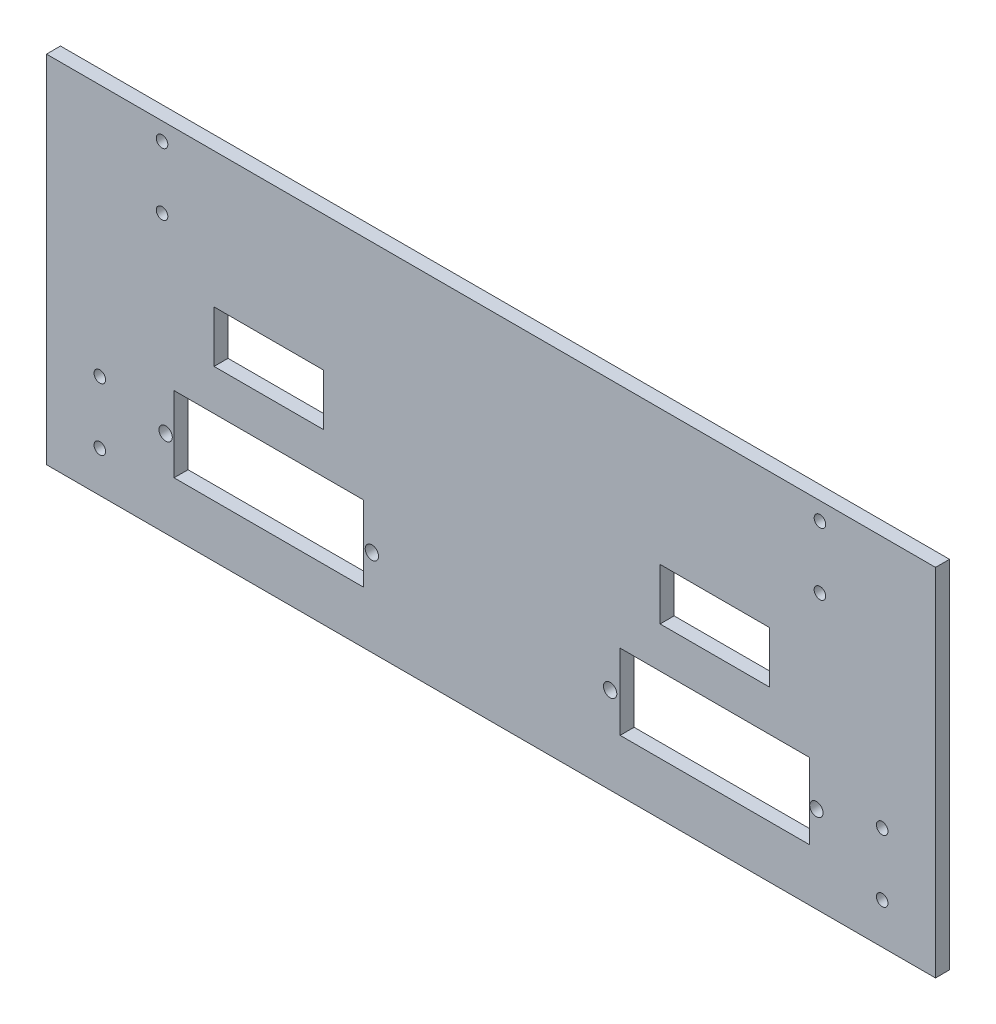
ISO-10303-21;
HEADER;
FILE_DESCRIPTION(('STEP AP214'),'2;1');
FILE_NAME('part.step','',(''),(''),'','','');
FILE_SCHEMA(('AUTOMOTIVE_DESIGN { 1 0 10303 214 1 1 1 1 }'));
ENDSEC;
DATA;
#1=APPLICATION_CONTEXT('core data for automotive mechanical design processes');
#2=APPLICATION_PROTOCOL_DEFINITION('international standard','automotive_design',2000,#1);
#3=PRODUCT_CONTEXT('',#1,'mechanical');
#4=PRODUCT('Part','Part','',(#3));
#5=PRODUCT_RELATED_PRODUCT_CATEGORY('part','',(#4));
#6=PRODUCT_DEFINITION_FORMATION('','',#4);
#7=PRODUCT_DEFINITION_CONTEXT('part definition',#1,'design');
#8=PRODUCT_DEFINITION('design','',#6,#7);
#9=PRODUCT_DEFINITION_SHAPE('','',#8);
#10=(LENGTH_UNIT() NAMED_UNIT(*) SI_UNIT(.MILLI.,.METRE.));
#11=(NAMED_UNIT(*) PLANE_ANGLE_UNIT() SI_UNIT($,.RADIAN.));
#12=(NAMED_UNIT(*) SI_UNIT($,.STERADIAN.) SOLID_ANGLE_UNIT());
#13=UNCERTAINTY_MEASURE_WITH_UNIT(LENGTH_MEASURE(1.E-05),#10,'distance_accuracy_value','');
#14=(GEOMETRIC_REPRESENTATION_CONTEXT(3) GLOBAL_UNCERTAINTY_ASSIGNED_CONTEXT((#13)) GLOBAL_UNIT_ASSIGNED_CONTEXT((#10,
#11,#12)) REPRESENTATION_CONTEXT('',''));
#15=CARTESIAN_POINT('',(0.,0.,0.));
#16=DIRECTION('',(0.,0.,1.));
#17=DIRECTION('',(1.,0.,0.));
#18=AXIS2_PLACEMENT_3D('',#15,#16,#17);
#19=CARTESIAN_POINT('',(0.,0.,4.));
#20=DIRECTION('',(0.,0.,-1.));
#21=DIRECTION('',(-1.,0.,0.));
#22=AXIS2_PLACEMENT_3D('',#19,#20,#21);
#23=PLANE('',#22);
#24=DIRECTION('',(0.,1.,0.));
#25=VECTOR('',#24,1.);
#26=CARTESIAN_POINT('',(79.121,62.992,4.));
#27=LINE('',#26,#25);
#28=CARTESIAN_POINT('',(79.121,48.26,4.));
#29=VERTEX_POINT('',#28);
#30=CARTESIAN_POINT('',(79.121,62.992,4.));
#31=VERTEX_POINT('',#30);
#32=EDGE_CURVE('E229',#29,#31,#27,.T.);
#33=ORIENTED_EDGE('',*,*,#32,.F.);
#34=DIRECTION('',(1.,0.,0.));
#35=VECTOR('',#34,1.);
#36=CARTESIAN_POINT('',(47.879,48.26,4.));
#37=LINE('',#36,#35);
#38=CARTESIAN_POINT('',(47.879,48.26,4.));
#39=VERTEX_POINT('',#38);
#40=EDGE_CURVE('E240',#39,#29,#37,.T.);
#41=ORIENTED_EDGE('',*,*,#40,.F.);
#42=DIRECTION('',(0.,-1.,0.));
#43=VECTOR('',#42,1.);
#44=CARTESIAN_POINT('',(47.879,62.992,4.));
#45=LINE('',#44,#43);
#46=CARTESIAN_POINT('',(47.879,62.992,4.));
#47=VERTEX_POINT('',#46);
#48=EDGE_CURVE('E236',#47,#39,#45,.T.);
#49=ORIENTED_EDGE('',*,*,#48,.F.);
#50=DIRECTION('',(-1.,0.,0.));
#51=VECTOR('',#50,1.);
#52=CARTESIAN_POINT('',(47.879,62.992,4.));
#53=LINE('',#52,#51);
#54=EDGE_CURVE('E232',#31,#47,#53,.T.);
#55=ORIENTED_EDGE('',*,*,#54,.F.);
#56=EDGE_LOOP('',(#33,#41,#49,#55));
#57=FACE_BOUND('',#56,.T.);
#58=CARTESIAN_POINT('',(15.24,29.464,4.));
#59=DIRECTION('',(0.,0.,1.));
#60=DIRECTION('',(1.,0.,0.));
#61=AXIS2_PLACEMENT_3D('',#58,#59,#60);
#62=CIRCLE('',#61,1.651);
#63=CARTESIAN_POINT('',(16.891,29.464,4.));
#64=VERTEX_POINT('',#63);
#65=EDGE_CURVE('E345',#64,#64,#62,.T.);
#66=ORIENTED_EDGE('',*,*,#65,.F.);
#67=EDGE_LOOP('',(#66));
#68=FACE_BOUND('',#67,.T.);
#69=CARTESIAN_POINT('',(15.24,11.684,4.));
#70=DIRECTION('',(0.,0.,1.));
#71=DIRECTION('',(1.,0.,0.));
#72=AXIS2_PLACEMENT_3D('',#69,#70,#71);
#73=CIRCLE('',#72,1.651);
#74=CARTESIAN_POINT('',(16.891,11.684,4.));
#75=VERTEX_POINT('',#74);
#76=EDGE_CURVE('E353',#75,#75,#73,.T.);
#77=ORIENTED_EDGE('',*,*,#76,.F.);
#78=EDGE_LOOP('',(#77));
#79=FACE_BOUND('',#78,.T.);
#80=CARTESIAN_POINT('',(220.98,96.52,4.));
#81=DIRECTION('',(0.,0.,1.));
#82=DIRECTION('',(1.,0.,0.));
#83=AXIS2_PLACEMENT_3D('',#80,#81,#82);
#84=CIRCLE('',#83,1.65099999999999);
#85=CARTESIAN_POINT('',(222.631,96.52,4.));
#86=VERTEX_POINT('',#85);
#87=EDGE_CURVE('E361',#86,#86,#84,.T.);
#88=ORIENTED_EDGE('',*,*,#87,.F.);
#89=EDGE_LOOP('',(#88));
#90=FACE_BOUND('',#89,.T.);
#91=CARTESIAN_POINT('',(220.98,78.74,4.));
#92=DIRECTION('',(0.,0.,1.));
#93=DIRECTION('',(1.,0.,0.));
#94=AXIS2_PLACEMENT_3D('',#91,#92,#93);
#95=CIRCLE('',#94,1.65099999999999);
#96=CARTESIAN_POINT('',(222.631,78.74,4.));
#97=VERTEX_POINT('',#96);
#98=EDGE_CURVE('E369',#97,#97,#95,.T.);
#99=ORIENTED_EDGE('',*,*,#98,.F.);
#100=EDGE_LOOP('',(#99));
#101=FACE_BOUND('',#100,.T.);
#102=CARTESIAN_POINT('',(33.02,96.52,4.));
#103=DIRECTION('',(0.,0.,1.));
#104=DIRECTION('',(1.,0.,0.));
#105=AXIS2_PLACEMENT_3D('',#102,#103,#104);
#106=CIRCLE('',#105,1.651);
#107=CARTESIAN_POINT('',(34.671,96.52,4.));
#108=VERTEX_POINT('',#107);
#109=EDGE_CURVE('E377',#108,#108,#106,.T.);
#110=ORIENTED_EDGE('',*,*,#109,.F.);
#111=EDGE_LOOP('',(#110));
#112=FACE_BOUND('',#111,.T.);
#113=CARTESIAN_POINT('',(33.02,78.74,4.));
#114=DIRECTION('',(0.,0.,1.));
#115=DIRECTION('',(1.,0.,0.));
#116=AXIS2_PLACEMENT_3D('',#113,#114,#115);
#117=CIRCLE('',#116,1.651);
#118=CARTESIAN_POINT('',(34.671,78.74,4.));
#119=VERTEX_POINT('',#118);
#120=EDGE_CURVE('E385',#119,#119,#117,.T.);
#121=ORIENTED_EDGE('',*,*,#120,.F.);
#122=EDGE_LOOP('',(#121));
#123=FACE_BOUND('',#122,.T.);
#124=CARTESIAN_POINT('',(92.964,24.765,4.));
#125=DIRECTION('',(0.,0.,1.));
#126=DIRECTION('',(1.,0.,0.));
#127=AXIS2_PLACEMENT_3D('',#124,#125,#126);
#128=CIRCLE('',#127,1.90500000000001);
#129=CARTESIAN_POINT('',(94.869,24.765,4.));
#130=VERTEX_POINT('',#129);
#131=EDGE_CURVE('E393',#130,#130,#128,.T.);
#132=ORIENTED_EDGE('',*,*,#131,.F.);
#133=EDGE_LOOP('',(#132));
#134=FACE_BOUND('',#133,.T.);
#135=CARTESIAN_POINT('',(34.036,24.765,4.));
#136=DIRECTION('',(0.,0.,1.));
#137=DIRECTION('',(1.,0.,0.));
#138=AXIS2_PLACEMENT_3D('',#135,#136,#137);
#139=CIRCLE('',#138,1.905);
#140=CARTESIAN_POINT('',(35.941,24.765,4.));
#141=VERTEX_POINT('',#140);
#142=EDGE_CURVE('E401',#141,#141,#139,.T.);
#143=ORIENTED_EDGE('',*,*,#142,.F.);
#144=EDGE_LOOP('',(#143));
#145=FACE_BOUND('',#144,.T.);
#146=DIRECTION('',(1.,0.,0.));
#147=VECTOR('',#146,1.);
#148=CARTESIAN_POINT('',(36.449,14.986,4.));
#149=LINE('',#148,#147);
#150=CARTESIAN_POINT('',(36.449,14.986,4.));
#151=VERTEX_POINT('',#150);
#152=CARTESIAN_POINT('',(90.551,14.986,4.));
#153=VERTEX_POINT('',#152);
#154=EDGE_CURVE('E409',#151,#153,#149,.T.);
#155=ORIENTED_EDGE('',*,*,#154,.F.);
#156=DIRECTION('',(0.,-1.,0.));
#157=VECTOR('',#156,1.);
#158=CARTESIAN_POINT('',(36.449,36.576,4.));
#159=LINE('',#158,#157);
#160=CARTESIAN_POINT('',(36.449,36.576,4.));
#161=VERTEX_POINT('',#160);
#162=EDGE_CURVE('E420',#161,#151,#159,.T.);
#163=ORIENTED_EDGE('',*,*,#162,.F.);
#164=DIRECTION('',(-1.,0.,0.));
#165=VECTOR('',#164,1.);
#166=CARTESIAN_POINT('',(90.551,36.576,4.));
#167=LINE('',#166,#165);
#168=CARTESIAN_POINT('',(90.551,36.576,4.));
#169=VERTEX_POINT('',#168);
#170=EDGE_CURVE('E416',#169,#161,#167,.T.);
#171=ORIENTED_EDGE('',*,*,#170,.F.);
#172=DIRECTION('',(0.,1.,0.));
#173=VECTOR('',#172,1.);
#174=CARTESIAN_POINT('',(90.551,14.986,4.));
#175=LINE('',#174,#173);
#176=EDGE_CURVE('E412',#153,#169,#175,.T.);
#177=ORIENTED_EDGE('',*,*,#176,.F.);
#178=EDGE_LOOP('',(#155,#163,#171,#177));
#179=FACE_BOUND('',#178,.T.);
#180=DIRECTION('',(1.,0.,0.));
#181=VECTOR('',#180,1.);
#182=CARTESIAN_POINT('',(0.,0.,4.));
#183=LINE('',#182,#181);
#184=CARTESIAN_POINT('',(0.,0.,4.));
#185=VERTEX_POINT('',#184);
#186=CARTESIAN_POINT('',(254.,0.,4.));
#187=VERTEX_POINT('',#186);
#188=EDGE_CURVE('E450',#185,#187,#183,.T.);
#189=ORIENTED_EDGE('',*,*,#188,.T.);
#190=DIRECTION('',(0.,1.,0.));
#191=VECTOR('',#190,1.);
#192=CARTESIAN_POINT('',(254.,101.6,4.));
#193=LINE('',#192,#191);
#194=CARTESIAN_POINT('',(254.,101.6,4.));
#195=VERTEX_POINT('',#194);
#196=EDGE_CURVE('E454',#187,#195,#193,.T.);
#197=ORIENTED_EDGE('',*,*,#196,.T.);
#198=DIRECTION('',(-1.,0.,0.));
#199=VECTOR('',#198,1.);
#200=CARTESIAN_POINT('',(0.,101.6,4.));
#201=LINE('',#200,#199);
#202=CARTESIAN_POINT('',(0.,101.6,4.));
#203=VERTEX_POINT('',#202);
#204=EDGE_CURVE('E458',#195,#203,#201,.T.);
#205=ORIENTED_EDGE('',*,*,#204,.T.);
#206=DIRECTION('',(0.,-1.,0.));
#207=VECTOR('',#206,1.);
#208=CARTESIAN_POINT('',(0.,0.,4.));
#209=LINE('',#208,#207);
#210=EDGE_CURVE('E461',#203,#185,#209,.T.);
#211=ORIENTED_EDGE('',*,*,#210,.T.);
#212=EDGE_LOOP('',(#189,#197,#205,#211));
#213=FACE_BOUND('',#212,.T.);
#214=DIRECTION('',(1.,0.,0.));
#215=VECTOR('',#214,1.);
#216=CARTESIAN_POINT('',(163.890331934584,14.9805038898976,4.));
#217=LINE('',#216,#215);
#218=CARTESIAN_POINT('',(163.890331934584,14.9805038898976,4.));
#219=VERTEX_POINT('',#218);
#220=CARTESIAN_POINT('',(217.992332171612,14.9805038898976,4.));
#221=VERTEX_POINT('',#220);
#222=EDGE_CURVE('E304',#219,#221,#217,.T.);
#223=ORIENTED_EDGE('',*,*,#222,.F.);
#224=DIRECTION('',(0.,-1.,0.));
#225=VECTOR('',#224,1.);
#226=CARTESIAN_POINT('',(163.890331934584,36.5705038898976,4.));
#227=LINE('',#226,#225);
#228=CARTESIAN_POINT('',(163.890331934584,36.5705038898976,4.));
#229=VERTEX_POINT('',#228);
#230=EDGE_CURVE('E315',#229,#219,#227,.T.);
#231=ORIENTED_EDGE('',*,*,#230,.F.);
#232=DIRECTION('',(-1.,0.,0.));
#233=VECTOR('',#232,1.);
#234=CARTESIAN_POINT('',(217.992332171612,36.5705038898976,4.));
#235=LINE('',#234,#233);
#236=CARTESIAN_POINT('',(217.992332171612,36.5705038898976,4.));
#237=VERTEX_POINT('',#236);
#238=EDGE_CURVE('E311',#237,#229,#235,.T.);
#239=ORIENTED_EDGE('',*,*,#238,.F.);
#240=DIRECTION('',(0.,1.,0.));
#241=VECTOR('',#240,1.);
#242=CARTESIAN_POINT('',(217.992332171612,14.9805038898976,4.));
#243=LINE('',#242,#241);
#244=EDGE_CURVE('E307',#221,#237,#243,.T.);
#245=ORIENTED_EDGE('',*,*,#244,.F.);
#246=EDGE_LOOP('',(#223,#231,#239,#245));
#247=FACE_BOUND('',#246,.T.);
#248=CARTESIAN_POINT('',(161.036,24.765,4.));
#249=DIRECTION('',(0.,0.,1.));
#250=DIRECTION('',(1.,0.,0.));
#251=AXIS2_PLACEMENT_3D('',#248,#249,#250);
#252=CIRCLE('',#251,1.90499999999999);
#253=CARTESIAN_POINT('',(162.941,24.765,4.));
#254=VERTEX_POINT('',#253);
#255=EDGE_CURVE('E296',#254,#254,#252,.T.);
#256=ORIENTED_EDGE('',*,*,#255,.F.);
#257=EDGE_LOOP('',(#256));
#258=FACE_BOUND('',#257,.T.);
#259=CARTESIAN_POINT('',(219.964,24.765,4.));
#260=DIRECTION('',(0.,0.,1.));
#261=DIRECTION('',(1.,0.,0.));
#262=AXIS2_PLACEMENT_3D('',#259,#260,#261);
#263=CIRCLE('',#262,1.90499999999999);
#264=CARTESIAN_POINT('',(221.869,24.765,4.));
#265=VERTEX_POINT('',#264);
#266=EDGE_CURVE('E288',#265,#265,#263,.T.);
#267=ORIENTED_EDGE('',*,*,#266,.F.);
#268=EDGE_LOOP('',(#267));
#269=FACE_BOUND('',#268,.T.);
#270=CARTESIAN_POINT('',(238.76,29.464,4.));
#271=DIRECTION('',(0.,0.,1.));
#272=DIRECTION('',(1.,0.,0.));
#273=AXIS2_PLACEMENT_3D('',#270,#271,#272);
#274=CIRCLE('',#273,1.65099999999999);
#275=CARTESIAN_POINT('',(240.411,29.464,4.));
#276=VERTEX_POINT('',#275);
#277=EDGE_CURVE('E280',#276,#276,#274,.T.);
#278=ORIENTED_EDGE('',*,*,#277,.F.);
#279=EDGE_LOOP('',(#278));
#280=FACE_BOUND('',#279,.T.);
#281=CARTESIAN_POINT('',(238.76,11.684,4.));
#282=DIRECTION('',(0.,0.,1.));
#283=DIRECTION('',(1.,0.,0.));
#284=AXIS2_PLACEMENT_3D('',#281,#282,#283);
#285=CIRCLE('',#284,1.65099999999999);
#286=CARTESIAN_POINT('',(240.411,11.684,4.));
#287=VERTEX_POINT('',#286);
#288=EDGE_CURVE('E272',#287,#287,#285,.T.);
#289=ORIENTED_EDGE('',*,*,#288,.F.);
#290=EDGE_LOOP('',(#289));
#291=FACE_BOUND('',#290,.T.);
#292=DIRECTION('',(0.,1.,0.));
#293=VECTOR('',#292,1.);
#294=CARTESIAN_POINT('',(206.562332053098,62.992,4.));
#295=LINE('',#294,#293);
#296=CARTESIAN_POINT('',(206.562332053098,48.26,4.));
#297=VERTEX_POINT('',#296);
#298=CARTESIAN_POINT('',(206.562332053098,62.992,4.));
#299=VERTEX_POINT('',#298);
#300=EDGE_CURVE('E181',#297,#299,#295,.T.);
#301=ORIENTED_EDGE('',*,*,#300,.F.);
#302=DIRECTION('',(1.,0.,0.));
#303=VECTOR('',#302,1.);
#304=CARTESIAN_POINT('',(175.320332053098,48.26,4.));
#305=LINE('',#304,#303);
#306=CARTESIAN_POINT('',(175.320332053098,48.26,4.));
#307=VERTEX_POINT('',#306);
#308=EDGE_CURVE('E207',#307,#297,#305,.T.);
#309=ORIENTED_EDGE('',*,*,#308,.F.);
#310=DIRECTION('',(0.,-1.,0.));
#311=VECTOR('',#310,1.);
#312=CARTESIAN_POINT('',(175.320332053098,62.992,4.));
#313=LINE('',#312,#311);
#314=CARTESIAN_POINT('',(175.320332053098,62.992,4.));
#315=VERTEX_POINT('',#314);
#316=EDGE_CURVE('E203',#315,#307,#313,.T.);
#317=ORIENTED_EDGE('',*,*,#316,.F.);
#318=DIRECTION('',(-1.,0.,0.));
#319=VECTOR('',#318,1.);
#320=CARTESIAN_POINT('',(175.320332053098,62.992,4.));
#321=LINE('',#320,#319);
#322=EDGE_CURVE('E190',#299,#315,#321,.T.);
#323=ORIENTED_EDGE('',*,*,#322,.F.);
#324=EDGE_LOOP('',(#301,#309,#317,#323));
#325=FACE_BOUND('',#324,.T.);
#326=ADVANCED_FACE('F43',(#57,#68,#79,#90,#101,#112,#123,#134,#145,#179,#213,#247,#258,#269,
#280,#291,#325),#23,.F.);
#327=CARTESIAN_POINT('',(0.,0.,0.));
#328=DIRECTION('',(0.,0.,-1.));
#329=DIRECTION('',(-1.,0.,0.));
#330=AXIS2_PLACEMENT_3D('',#327,#328,#329);
#331=PLANE('',#330);
#332=CARTESIAN_POINT('',(238.76,29.464,0.));
#333=DIRECTION('',(0.,0.,1.));
#334=DIRECTION('',(1.,0.,0.));
#335=AXIS2_PLACEMENT_3D('',#332,#333,#334);
#336=CIRCLE('',#335,1.65099999999999);
#337=CARTESIAN_POINT('',(240.411,29.464,0.));
#338=VERTEX_POINT('',#337);
#339=EDGE_CURVE('E276',#338,#338,#336,.T.);
#340=ORIENTED_EDGE('',*,*,#339,.T.);
#341=EDGE_LOOP('',(#340));
#342=FACE_BOUND('',#341,.T.);
#343=CARTESIAN_POINT('',(161.036,24.765,0.));
#344=DIRECTION('',(0.,0.,1.));
#345=DIRECTION('',(1.,0.,0.));
#346=AXIS2_PLACEMENT_3D('',#343,#344,#345);
#347=CIRCLE('',#346,1.90499999999999);
#348=CARTESIAN_POINT('',(162.941,24.765,0.));
#349=VERTEX_POINT('',#348);
#350=EDGE_CURVE('E292',#349,#349,#347,.T.);
#351=ORIENTED_EDGE('',*,*,#350,.T.);
#352=EDGE_LOOP('',(#351));
#353=FACE_BOUND('',#352,.T.);
#354=CARTESIAN_POINT('',(15.24,11.684,0.));
#355=DIRECTION('',(0.,0.,1.));
#356=DIRECTION('',(1.,0.,0.));
#357=AXIS2_PLACEMENT_3D('',#354,#355,#356);
#358=CIRCLE('',#357,1.651);
#359=CARTESIAN_POINT('',(16.891,11.684,0.));
#360=VERTEX_POINT('',#359);
#361=EDGE_CURVE('E349',#360,#360,#358,.T.);
#362=ORIENTED_EDGE('',*,*,#361,.T.);
#363=EDGE_LOOP('',(#362));
#364=FACE_BOUND('',#363,.T.);
#365=CARTESIAN_POINT('',(220.98,78.74,0.));
#366=DIRECTION('',(0.,0.,1.));
#367=DIRECTION('',(1.,0.,0.));
#368=AXIS2_PLACEMENT_3D('',#365,#366,#367);
#369=CIRCLE('',#368,1.65099999999999);
#370=CARTESIAN_POINT('',(222.631,78.74,0.));
#371=VERTEX_POINT('',#370);
#372=EDGE_CURVE('E365',#371,#371,#369,.T.);
#373=ORIENTED_EDGE('',*,*,#372,.T.);
#374=EDGE_LOOP('',(#373));
#375=FACE_BOUND('',#374,.T.);
#376=CARTESIAN_POINT('',(33.02,78.74,0.));
#377=DIRECTION('',(0.,0.,1.));
#378=DIRECTION('',(1.,0.,0.));
#379=AXIS2_PLACEMENT_3D('',#376,#377,#378);
#380=CIRCLE('',#379,1.651);
#381=CARTESIAN_POINT('',(34.671,78.74,0.));
#382=VERTEX_POINT('',#381);
#383=EDGE_CURVE('E381',#382,#382,#380,.T.);
#384=ORIENTED_EDGE('',*,*,#383,.T.);
#385=EDGE_LOOP('',(#384));
#386=FACE_BOUND('',#385,.T.);
#387=CARTESIAN_POINT('',(34.036,24.765,0.));
#388=DIRECTION('',(0.,0.,1.));
#389=DIRECTION('',(1.,0.,0.));
#390=AXIS2_PLACEMENT_3D('',#387,#388,#389);
#391=CIRCLE('',#390,1.905);
#392=CARTESIAN_POINT('',(35.941,24.765,0.));
#393=VERTEX_POINT('',#392);
#394=EDGE_CURVE('E397',#393,#393,#391,.T.);
#395=ORIENTED_EDGE('',*,*,#394,.T.);
#396=EDGE_LOOP('',(#395));
#397=FACE_BOUND('',#396,.T.);
#398=DIRECTION('',(1.,0.,0.));
#399=VECTOR('',#398,1.);
#400=CARTESIAN_POINT('',(0.,0.,0.));
#401=LINE('',#400,#399);
#402=CARTESIAN_POINT('',(0.,0.,0.));
#403=VERTEX_POINT('',#402);
#404=CARTESIAN_POINT('',(254.,0.,0.));
#405=VERTEX_POINT('',#404);
#406=EDGE_CURVE('E449',#403,#405,#401,.T.);
#407=ORIENTED_EDGE('',*,*,#406,.F.);
#408=DIRECTION('',(0.,-1.,0.));
#409=VECTOR('',#408,1.);
#410=CARTESIAN_POINT('',(0.,0.,0.));
#411=LINE('',#410,#409);
#412=CARTESIAN_POINT('',(0.,101.6,0.));
#413=VERTEX_POINT('',#412);
#414=EDGE_CURVE('E455',#413,#403,#411,.T.);
#415=ORIENTED_EDGE('',*,*,#414,.F.);
#416=DIRECTION('',(-1.,0.,0.));
#417=VECTOR('',#416,1.);
#418=CARTESIAN_POINT('',(0.,101.6,0.));
#419=LINE('',#418,#417);
#420=CARTESIAN_POINT('',(254.,101.6,0.));
#421=VERTEX_POINT('',#420);
#422=EDGE_CURVE('E471',#421,#413,#419,.T.);
#423=ORIENTED_EDGE('',*,*,#422,.F.);
#424=DIRECTION('',(0.,1.,0.));
#425=VECTOR('',#424,1.);
#426=CARTESIAN_POINT('',(254.,101.6,0.));
#427=LINE('',#426,#425);
#428=EDGE_CURVE('E468',#405,#421,#427,.T.);
#429=ORIENTED_EDGE('',*,*,#428,.F.);
#430=EDGE_LOOP('',(#407,#415,#423,#429));
#431=FACE_BOUND('',#430,.T.);
#432=DIRECTION('',(0.,-1.,0.));
#433=VECTOR('',#432,1.);
#434=CARTESIAN_POINT('',(36.449,36.576,0.));
#435=LINE('',#434,#433);
#436=CARTESIAN_POINT('',(36.449,36.576,0.));
#437=VERTEX_POINT('',#436);
#438=CARTESIAN_POINT('',(36.449,14.986,0.));
#439=VERTEX_POINT('',#438);
#440=EDGE_CURVE('E413',#437,#439,#435,.T.);
#441=ORIENTED_EDGE('',*,*,#440,.T.);
#442=DIRECTION('',(1.,0.,0.));
#443=VECTOR('',#442,1.);
#444=CARTESIAN_POINT('',(63.5,14.986,0.));
#445=LINE('',#444,#443);
#446=CARTESIAN_POINT('',(90.551,14.986,0.));
#447=VERTEX_POINT('',#446);
#448=EDGE_CURVE('E405',#439,#447,#445,.T.);
#449=ORIENTED_EDGE('',*,*,#448,.T.);
#450=DIRECTION('',(0.,1.,0.));
#451=VECTOR('',#450,1.);
#452=CARTESIAN_POINT('',(90.551,14.986,0.));
#453=LINE('',#452,#451);
#454=CARTESIAN_POINT('',(90.551,36.576,0.));
#455=VERTEX_POINT('',#454);
#456=EDGE_CURVE('E427',#447,#455,#453,.T.);
#457=ORIENTED_EDGE('',*,*,#456,.T.);
#458=DIRECTION('',(-1.,0.,0.));
#459=VECTOR('',#458,1.);
#460=CARTESIAN_POINT('',(90.551,36.576,0.));
#461=LINE('',#460,#459);
#462=EDGE_CURVE('E431',#455,#437,#461,.T.);
#463=ORIENTED_EDGE('',*,*,#462,.T.);
#464=EDGE_LOOP('',(#441,#449,#457,#463));
#465=FACE_BOUND('',#464,.T.);
#466=CARTESIAN_POINT('',(92.964,24.765,0.));
#467=DIRECTION('',(0.,0.,1.));
#468=DIRECTION('',(1.,0.,0.));
#469=AXIS2_PLACEMENT_3D('',#466,#467,#468);
#470=CIRCLE('',#469,1.90500000000001);
#471=CARTESIAN_POINT('',(94.869,24.765,0.));
#472=VERTEX_POINT('',#471);
#473=EDGE_CURVE('E389',#472,#472,#470,.T.);
#474=ORIENTED_EDGE('',*,*,#473,.T.);
#475=EDGE_LOOP('',(#474));
#476=FACE_BOUND('',#475,.T.);
#477=CARTESIAN_POINT('',(33.02,96.52,0.));
#478=DIRECTION('',(0.,0.,1.));
#479=DIRECTION('',(1.,0.,0.));
#480=AXIS2_PLACEMENT_3D('',#477,#478,#479);
#481=CIRCLE('',#480,1.651);
#482=CARTESIAN_POINT('',(34.671,96.52,0.));
#483=VERTEX_POINT('',#482);
#484=EDGE_CURVE('E373',#483,#483,#481,.T.);
#485=ORIENTED_EDGE('',*,*,#484,.T.);
#486=EDGE_LOOP('',(#485));
#487=FACE_BOUND('',#486,.T.);
#488=CARTESIAN_POINT('',(220.98,96.52,0.));
#489=DIRECTION('',(0.,0.,1.));
#490=DIRECTION('',(1.,0.,0.));
#491=AXIS2_PLACEMENT_3D('',#488,#489,#490);
#492=CIRCLE('',#491,1.65099999999999);
#493=CARTESIAN_POINT('',(222.631,96.52,0.));
#494=VERTEX_POINT('',#493);
#495=EDGE_CURVE('E357',#494,#494,#492,.T.);
#496=ORIENTED_EDGE('',*,*,#495,.T.);
#497=EDGE_LOOP('',(#496));
#498=FACE_BOUND('',#497,.T.);
#499=CARTESIAN_POINT('',(15.24,29.464,0.));
#500=DIRECTION('',(0.,0.,1.));
#501=DIRECTION('',(1.,0.,0.));
#502=AXIS2_PLACEMENT_3D('',#499,#500,#501);
#503=CIRCLE('',#502,1.651);
#504=CARTESIAN_POINT('',(16.891,29.464,0.));
#505=VERTEX_POINT('',#504);
#506=EDGE_CURVE('E344',#505,#505,#503,.T.);
#507=ORIENTED_EDGE('',*,*,#506,.T.);
#508=EDGE_LOOP('',(#507));
#509=FACE_BOUND('',#508,.T.);
#510=DIRECTION('',(0.,-1.,0.));
#511=VECTOR('',#510,1.);
#512=CARTESIAN_POINT('',(163.890331934584,36.5705038898976,0.));
#513=LINE('',#512,#511);
#514=CARTESIAN_POINT('',(163.890331934584,36.5705038898976,0.));
#515=VERTEX_POINT('',#514);
#516=CARTESIAN_POINT('',(163.890331934584,14.9805038898976,0.));
#517=VERTEX_POINT('',#516);
#518=EDGE_CURVE('E308',#515,#517,#513,.T.);
#519=ORIENTED_EDGE('',*,*,#518,.T.);
#520=DIRECTION('',(1.,0.,0.));
#521=VECTOR('',#520,1.);
#522=CARTESIAN_POINT('',(190.5,14.9805038898976,0.));
#523=LINE('',#522,#521);
#524=CARTESIAN_POINT('',(217.992332171612,14.9805038898976,0.));
#525=VERTEX_POINT('',#524);
#526=EDGE_CURVE('E300',#517,#525,#523,.T.);
#527=ORIENTED_EDGE('',*,*,#526,.T.);
#528=DIRECTION('',(0.,1.,0.));
#529=VECTOR('',#528,1.);
#530=CARTESIAN_POINT('',(217.992332171612,14.9805038898976,0.));
#531=LINE('',#530,#529);
#532=CARTESIAN_POINT('',(217.992332171612,36.5705038898976,0.));
#533=VERTEX_POINT('',#532);
#534=EDGE_CURVE('E322',#525,#533,#531,.T.);
#535=ORIENTED_EDGE('',*,*,#534,.T.);
#536=DIRECTION('',(-1.,0.,0.));
#537=VECTOR('',#536,1.);
#538=CARTESIAN_POINT('',(217.992332171612,36.5705038898976,0.));
#539=LINE('',#538,#537);
#540=EDGE_CURVE('E326',#533,#515,#539,.T.);
#541=ORIENTED_EDGE('',*,*,#540,.T.);
#542=EDGE_LOOP('',(#519,#527,#535,#541));
#543=FACE_BOUND('',#542,.T.);
#544=CARTESIAN_POINT('',(219.964,24.765,0.));
#545=DIRECTION('',(0.,0.,1.));
#546=DIRECTION('',(1.,0.,0.));
#547=AXIS2_PLACEMENT_3D('',#544,#545,#546);
#548=CIRCLE('',#547,1.90499999999999);
#549=CARTESIAN_POINT('',(221.869,24.765,0.));
#550=VERTEX_POINT('',#549);
#551=EDGE_CURVE('E284',#550,#550,#548,.T.);
#552=ORIENTED_EDGE('',*,*,#551,.T.);
#553=EDGE_LOOP('',(#552));
#554=FACE_BOUND('',#553,.T.);
#555=CARTESIAN_POINT('',(238.76,11.684,0.));
#556=DIRECTION('',(0.,0.,1.));
#557=DIRECTION('',(1.,0.,0.));
#558=AXIS2_PLACEMENT_3D('',#555,#556,#557);
#559=CIRCLE('',#558,1.65099999999999);
#560=CARTESIAN_POINT('',(240.411,11.684,0.));
#561=VERTEX_POINT('',#560);
#562=EDGE_CURVE('E271',#561,#561,#559,.T.);
#563=ORIENTED_EDGE('',*,*,#562,.T.);
#564=EDGE_LOOP('',(#563));
#565=FACE_BOUND('',#564,.T.);
#566=DIRECTION('',(1.,0.,0.));
#567=VECTOR('',#566,1.);
#568=CARTESIAN_POINT('',(47.879,48.26,0.));
#569=LINE('',#568,#567);
#570=CARTESIAN_POINT('',(47.879,48.26,0.));
#571=VERTEX_POINT('',#570);
#572=CARTESIAN_POINT('',(79.121,48.26,0.));
#573=VERTEX_POINT('',#572);
#574=EDGE_CURVE('E233',#571,#573,#569,.T.);
#575=ORIENTED_EDGE('',*,*,#574,.T.);
#576=DIRECTION('',(0.,1.,0.));
#577=VECTOR('',#576,1.);
#578=CARTESIAN_POINT('',(79.121,62.992,0.));
#579=LINE('',#578,#577);
#580=CARTESIAN_POINT('',(79.121,62.992,0.));
#581=VERTEX_POINT('',#580);
#582=EDGE_CURVE('E199',#573,#581,#579,.T.);
#583=ORIENTED_EDGE('',*,*,#582,.T.);
#584=DIRECTION('',(-1.,0.,0.));
#585=VECTOR('',#584,1.);
#586=CARTESIAN_POINT('',(47.879,62.992,0.));
#587=LINE('',#586,#585);
#588=CARTESIAN_POINT('',(47.879,62.992,0.));
#589=VERTEX_POINT('',#588);
#590=EDGE_CURVE('E247',#581,#589,#587,.T.);
#591=ORIENTED_EDGE('',*,*,#590,.T.);
#592=DIRECTION('',(0.,-1.,0.));
#593=VECTOR('',#592,1.);
#594=CARTESIAN_POINT('',(47.879,62.992,0.));
#595=LINE('',#594,#593);
#596=EDGE_CURVE('E251',#589,#571,#595,.T.);
#597=ORIENTED_EDGE('',*,*,#596,.T.);
#598=EDGE_LOOP('',(#575,#583,#591,#597));
#599=FACE_BOUND('',#598,.T.);
#600=DIRECTION('',(1.,0.,0.));
#601=VECTOR('',#600,1.);
#602=CARTESIAN_POINT('',(175.320332053098,48.26,0.));
#603=LINE('',#602,#601);
#604=CARTESIAN_POINT('',(175.320332053098,48.26,0.));
#605=VERTEX_POINT('',#604);
#606=CARTESIAN_POINT('',(206.562332053098,48.26,0.));
#607=VERTEX_POINT('',#606);
#608=EDGE_CURVE('E191',#605,#607,#603,.T.);
#609=ORIENTED_EDGE('',*,*,#608,.T.);
#610=DIRECTION('',(0.,1.,0.));
#611=VECTOR('',#610,1.);
#612=CARTESIAN_POINT('',(206.562332053098,62.992,0.));
#613=LINE('',#612,#611);
#614=CARTESIAN_POINT('',(206.562332053098,62.992,0.));
#615=VERTEX_POINT('',#614);
#616=EDGE_CURVE('E67',#607,#615,#613,.T.);
#617=ORIENTED_EDGE('',*,*,#616,.T.);
#618=DIRECTION('',(-1.,0.,0.));
#619=VECTOR('',#618,1.);
#620=CARTESIAN_POINT('',(175.320332053098,62.992,0.));
#621=LINE('',#620,#619);
#622=CARTESIAN_POINT('',(175.320332053098,62.992,0.));
#623=VERTEX_POINT('',#622);
#624=EDGE_CURVE('E197',#615,#623,#621,.T.);
#625=ORIENTED_EDGE('',*,*,#624,.T.);
#626=DIRECTION('',(0.,-1.,0.));
#627=VECTOR('',#626,1.);
#628=CARTESIAN_POINT('',(175.320332053098,62.992,0.));
#629=LINE('',#628,#627);
#630=EDGE_CURVE('E216',#623,#605,#629,.T.);
#631=ORIENTED_EDGE('',*,*,#630,.T.);
#632=EDGE_LOOP('',(#609,#617,#625,#631));
#633=FACE_BOUND('',#632,.T.);
#634=ADVANCED_FACE('F494',(#342,#353,#364,#375,#386,#397,#431,#465,#476,#487,#498,#509,#543,
#554,#565,#599,#633),#331,.T.);
#635=CARTESIAN_POINT('',(0.,0.,4.));
#636=DIRECTION('',(0.,1.,0.));
#637=DIRECTION('',(0.,0.,1.));
#638=AXIS2_PLACEMENT_3D('',#635,#636,#637);
#639=PLANE('',#638);
#640=ORIENTED_EDGE('',*,*,#406,.T.);
#641=DIRECTION('',(0.,0.,-1.));
#642=VECTOR('',#641,1.);
#643=CARTESIAN_POINT('',(254.,0.,4.));
#644=LINE('',#643,#642);
#645=EDGE_CURVE('E11',#187,#405,#644,.T.);
#646=ORIENTED_EDGE('',*,*,#645,.F.);
#647=ORIENTED_EDGE('',*,*,#188,.F.);
#648=DIRECTION('',(0.,0.,-1.));
#649=VECTOR('',#648,1.);
#650=CARTESIAN_POINT('',(0.,0.,4.));
#651=LINE('',#650,#649);
#652=EDGE_CURVE('E464',#185,#403,#651,.T.);
#653=ORIENTED_EDGE('',*,*,#652,.T.);
#654=EDGE_LOOP('',(#640,#646,#647,#653));
#655=FACE_BOUND('',#654,.T.);
#656=ADVANCED_FACE('F45',(#655),#639,.F.);
#657=CARTESIAN_POINT('',(254.,101.6,4.));
#658=DIRECTION('',(-1.,0.,0.));
#659=DIRECTION('',(0.,0.,1.));
#660=AXIS2_PLACEMENT_3D('',#657,#658,#659);
#661=PLANE('',#660);
#662=ORIENTED_EDGE('',*,*,#428,.T.);
#663=DIRECTION('',(0.,0.,-1.));
#664=VECTOR('',#663,1.);
#665=CARTESIAN_POINT('',(254.,101.6,4.));
#666=LINE('',#665,#664);
#667=EDGE_CURVE('E52',#195,#421,#666,.T.);
#668=ORIENTED_EDGE('',*,*,#667,.F.);
#669=ORIENTED_EDGE('',*,*,#196,.F.);
#670=ORIENTED_EDGE('',*,*,#645,.T.);
#671=EDGE_LOOP('',(#662,#668,#669,#670));
#672=FACE_BOUND('',#671,.T.);
#673=ADVANCED_FACE('F505',(#672),#661,.F.);
#674=CARTESIAN_POINT('',(0.,101.6,4.));
#675=DIRECTION('',(0.,-1.,0.));
#676=DIRECTION('',(0.,0.,-1.));
#677=AXIS2_PLACEMENT_3D('',#674,#675,#676);
#678=PLANE('',#677);
#679=ORIENTED_EDGE('',*,*,#422,.T.);
#680=DIRECTION('',(0.,0.,-1.));
#681=VECTOR('',#680,1.);
#682=CARTESIAN_POINT('',(0.,101.6,4.));
#683=LINE('',#682,#681);
#684=EDGE_CURVE('E479',#203,#413,#683,.T.);
#685=ORIENTED_EDGE('',*,*,#684,.F.);
#686=ORIENTED_EDGE('',*,*,#204,.F.);
#687=ORIENTED_EDGE('',*,*,#667,.T.);
#688=EDGE_LOOP('',(#679,#685,#686,#687));
#689=FACE_BOUND('',#688,.T.);
#690=ADVANCED_FACE('F488',(#689),#678,.F.);
#691=CARTESIAN_POINT('',(0.,0.,4.));
#692=DIRECTION('',(1.,0.,0.));
#693=DIRECTION('',(0.,0.,-1.));
#694=AXIS2_PLACEMENT_3D('',#691,#692,#693);
#695=PLANE('',#694);
#696=ORIENTED_EDGE('',*,*,#414,.T.);
#697=ORIENTED_EDGE('',*,*,#652,.F.);
#698=ORIENTED_EDGE('',*,*,#210,.F.);
#699=ORIENTED_EDGE('',*,*,#684,.T.);
#700=EDGE_LOOP('',(#696,#697,#698,#699));
#701=FACE_BOUND('',#700,.T.);
#702=ADVANCED_FACE('F498',(#701),#695,.F.);
#703=CARTESIAN_POINT('',(63.5,14.986,4.));
#704=DIRECTION('',(0.,1.,0.));
#705=DIRECTION('',(-1.,0.,0.));
#706=AXIS2_PLACEMENT_3D('',#703,#704,#705);
#707=PLANE('',#706);
#708=ORIENTED_EDGE('',*,*,#448,.F.);
#709=DIRECTION('',(0.,0.,-1.));
#710=VECTOR('',#709,1.);
#711=CARTESIAN_POINT('',(36.449,14.986,4.));
#712=LINE('',#711,#710);
#713=EDGE_CURVE('E423',#151,#439,#712,.T.);
#714=ORIENTED_EDGE('',*,*,#713,.F.);
#715=ORIENTED_EDGE('',*,*,#154,.T.);
#716=DIRECTION('',(0.,0.,-1.));
#717=VECTOR('',#716,1.);
#718=CARTESIAN_POINT('',(90.551,14.986,4.));
#719=LINE('',#718,#717);
#720=EDGE_CURVE('E446',#153,#447,#719,.T.);
#721=ORIENTED_EDGE('',*,*,#720,.T.);
#722=EDGE_LOOP('',(#708,#714,#715,#721));
#723=FACE_BOUND('',#722,.T.);
#724=ADVANCED_FACE('F523',(#723),#707,.T.);
#725=CARTESIAN_POINT('',(90.551,14.986,4.));
#726=DIRECTION('',(-1.,0.,0.));
#727=DIRECTION('',(0.,0.,1.));
#728=AXIS2_PLACEMENT_3D('',#725,#726,#727);
#729=PLANE('',#728);
#730=ORIENTED_EDGE('',*,*,#456,.F.);
#731=ORIENTED_EDGE('',*,*,#720,.F.);
#732=ORIENTED_EDGE('',*,*,#176,.T.);
#733=DIRECTION('',(0.,0.,-1.));
#734=VECTOR('',#733,1.);
#735=CARTESIAN_POINT('',(90.551,36.576,4.));
#736=LINE('',#735,#734);
#737=EDGE_CURVE('E443',#169,#455,#736,.T.);
#738=ORIENTED_EDGE('',*,*,#737,.T.);
#739=EDGE_LOOP('',(#730,#731,#732,#738));
#740=FACE_BOUND('',#739,.T.);
#741=ADVANCED_FACE('F530',(#740),#729,.T.);
#742=CARTESIAN_POINT('',(90.551,36.576,4.));
#743=DIRECTION('',(0.,-1.,0.));
#744=DIRECTION('',(1.,0.,0.));
#745=AXIS2_PLACEMENT_3D('',#742,#743,#744);
#746=PLANE('',#745);
#747=ORIENTED_EDGE('',*,*,#462,.F.);
#748=ORIENTED_EDGE('',*,*,#737,.F.);
#749=ORIENTED_EDGE('',*,*,#170,.T.);
#750=DIRECTION('',(0.,0.,-1.));
#751=VECTOR('',#750,1.);
#752=CARTESIAN_POINT('',(36.449,36.576,4.));
#753=LINE('',#752,#751);
#754=EDGE_CURVE('E440',#161,#437,#753,.T.);
#755=ORIENTED_EDGE('',*,*,#754,.T.);
#756=EDGE_LOOP('',(#747,#748,#749,#755));
#757=FACE_BOUND('',#756,.T.);
#758=ADVANCED_FACE('F535',(#757),#746,.T.);
#759=CARTESIAN_POINT('',(36.449,36.576,4.));
#760=DIRECTION('',(1.,0.,0.));
#761=DIRECTION('',(0.,0.,-1.));
#762=AXIS2_PLACEMENT_3D('',#759,#760,#761);
#763=PLANE('',#762);
#764=ORIENTED_EDGE('',*,*,#440,.F.);
#765=ORIENTED_EDGE('',*,*,#754,.F.);
#766=ORIENTED_EDGE('',*,*,#162,.T.);
#767=ORIENTED_EDGE('',*,*,#713,.T.);
#768=EDGE_LOOP('',(#764,#765,#766,#767));
#769=FACE_BOUND('',#768,.T.);
#770=ADVANCED_FACE('F546',(#769),#763,.T.);
#771=CARTESIAN_POINT('',(34.036,24.765,4.));
#772=DIRECTION('',(0.,0.,-1.));
#773=DIRECTION('',(-1.,0.,0.));
#774=AXIS2_PLACEMENT_3D('',#771,#772,#773);
#775=CYLINDRICAL_SURFACE('',#774,1.905);
#776=ORIENTED_EDGE('',*,*,#142,.T.);
#777=EDGE_LOOP('',(#776));
#778=FACE_BOUND('',#777,.T.);
#779=ORIENTED_EDGE('',*,*,#394,.F.);
#780=EDGE_LOOP('',(#779));
#781=FACE_BOUND('',#780,.T.);
#782=ADVANCED_FACE('F558',(#778,#781),#775,.F.);
#783=CARTESIAN_POINT('',(92.964,24.765,4.));
#784=DIRECTION('',(0.,0.,-1.));
#785=DIRECTION('',(-1.,0.,0.));
#786=AXIS2_PLACEMENT_3D('',#783,#784,#785);
#787=CYLINDRICAL_SURFACE('',#786,1.90500000000001);
#788=ORIENTED_EDGE('',*,*,#131,.T.);
#789=EDGE_LOOP('',(#788));
#790=FACE_BOUND('',#789,.T.);
#791=ORIENTED_EDGE('',*,*,#473,.F.);
#792=EDGE_LOOP('',(#791));
#793=FACE_BOUND('',#792,.T.);
#794=ADVANCED_FACE('F563',(#790,#793),#787,.F.);
#795=CARTESIAN_POINT('',(33.02,78.74,4.));
#796=DIRECTION('',(0.,0.,-1.));
#797=DIRECTION('',(-1.,0.,0.));
#798=AXIS2_PLACEMENT_3D('',#795,#796,#797);
#799=CYLINDRICAL_SURFACE('',#798,1.651);
#800=ORIENTED_EDGE('',*,*,#120,.T.);
#801=EDGE_LOOP('',(#800));
#802=FACE_BOUND('',#801,.T.);
#803=ORIENTED_EDGE('',*,*,#383,.F.);
#804=EDGE_LOOP('',(#803));
#805=FACE_BOUND('',#804,.T.);
#806=ADVANCED_FACE('F567',(#802,#805),#799,.F.);
#807=CARTESIAN_POINT('',(33.02,96.52,4.));
#808=DIRECTION('',(0.,0.,-1.));
#809=DIRECTION('',(-1.,0.,0.));
#810=AXIS2_PLACEMENT_3D('',#807,#808,#809);
#811=CYLINDRICAL_SURFACE('',#810,1.651);
#812=ORIENTED_EDGE('',*,*,#109,.T.);
#813=EDGE_LOOP('',(#812));
#814=FACE_BOUND('',#813,.T.);
#815=ORIENTED_EDGE('',*,*,#484,.F.);
#816=EDGE_LOOP('',(#815));
#817=FACE_BOUND('',#816,.T.);
#818=ADVANCED_FACE('F571',(#814,#817),#811,.F.);
#819=CARTESIAN_POINT('',(220.98,78.74,4.));
#820=DIRECTION('',(0.,0.,-1.));
#821=DIRECTION('',(-1.,0.,0.));
#822=AXIS2_PLACEMENT_3D('',#819,#820,#821);
#823=CYLINDRICAL_SURFACE('',#822,1.65099999999999);
#824=ORIENTED_EDGE('',*,*,#98,.T.);
#825=EDGE_LOOP('',(#824));
#826=FACE_BOUND('',#825,.T.);
#827=ORIENTED_EDGE('',*,*,#372,.F.);
#828=EDGE_LOOP('',(#827));
#829=FACE_BOUND('',#828,.T.);
#830=ADVANCED_FACE('F575',(#826,#829),#823,.F.);
#831=CARTESIAN_POINT('',(220.98,96.52,4.));
#832=DIRECTION('',(0.,0.,-1.));
#833=DIRECTION('',(-1.,0.,0.));
#834=AXIS2_PLACEMENT_3D('',#831,#832,#833);
#835=CYLINDRICAL_SURFACE('',#834,1.65099999999999);
#836=ORIENTED_EDGE('',*,*,#87,.T.);
#837=EDGE_LOOP('',(#836));
#838=FACE_BOUND('',#837,.T.);
#839=ORIENTED_EDGE('',*,*,#495,.F.);
#840=EDGE_LOOP('',(#839));
#841=FACE_BOUND('',#840,.T.);
#842=ADVANCED_FACE('F579',(#838,#841),#835,.F.);
#843=CARTESIAN_POINT('',(15.24,11.684,4.));
#844=DIRECTION('',(0.,0.,-1.));
#845=DIRECTION('',(-1.,0.,0.));
#846=AXIS2_PLACEMENT_3D('',#843,#844,#845);
#847=CYLINDRICAL_SURFACE('',#846,1.651);
#848=ORIENTED_EDGE('',*,*,#76,.T.);
#849=EDGE_LOOP('',(#848));
#850=FACE_BOUND('',#849,.T.);
#851=ORIENTED_EDGE('',*,*,#361,.F.);
#852=EDGE_LOOP('',(#851));
#853=FACE_BOUND('',#852,.T.);
#854=ADVANCED_FACE('F583',(#850,#853),#847,.F.);
#855=CARTESIAN_POINT('',(15.24,29.464,4.));
#856=DIRECTION('',(0.,0.,-1.));
#857=DIRECTION('',(-1.,0.,0.));
#858=AXIS2_PLACEMENT_3D('',#855,#856,#857);
#859=CYLINDRICAL_SURFACE('',#858,1.651);
#860=ORIENTED_EDGE('',*,*,#65,.T.);
#861=EDGE_LOOP('',(#860));
#862=FACE_BOUND('',#861,.T.);
#863=ORIENTED_EDGE('',*,*,#506,.F.);
#864=EDGE_LOOP('',(#863));
#865=FACE_BOUND('',#864,.T.);
#866=ADVANCED_FACE('F587',(#862,#865),#859,.F.);
#867=CARTESIAN_POINT('',(190.5,14.9805038898976,4.));
#868=DIRECTION('',(0.,1.,0.));
#869=DIRECTION('',(-1.,0.,0.));
#870=AXIS2_PLACEMENT_3D('',#867,#868,#869);
#871=PLANE('',#870);
#872=ORIENTED_EDGE('',*,*,#526,.F.);
#873=DIRECTION('',(0.,0.,-1.));
#874=VECTOR('',#873,1.);
#875=CARTESIAN_POINT('',(163.890331934584,14.9805038898976,4.));
#876=LINE('',#875,#874);
#877=EDGE_CURVE('E318',#219,#517,#876,.T.);
#878=ORIENTED_EDGE('',*,*,#877,.F.);
#879=ORIENTED_EDGE('',*,*,#222,.T.);
#880=DIRECTION('',(0.,0.,-1.));
#881=VECTOR('',#880,1.);
#882=CARTESIAN_POINT('',(217.992332171612,14.9805038898976,4.));
#883=LINE('',#882,#881);
#884=EDGE_CURVE('E341',#221,#525,#883,.T.);
#885=ORIENTED_EDGE('',*,*,#884,.T.);
#886=EDGE_LOOP('',(#872,#878,#879,#885));
#887=FACE_BOUND('',#886,.T.);
#888=ADVANCED_FACE('F591',(#887),#871,.T.);
#889=CARTESIAN_POINT('',(217.992332171612,14.9805038898976,4.));
#890=DIRECTION('',(-1.,0.,0.));
#891=DIRECTION('',(0.,0.,1.));
#892=AXIS2_PLACEMENT_3D('',#889,#890,#891);
#893=PLANE('',#892);
#894=ORIENTED_EDGE('',*,*,#534,.F.);
#895=ORIENTED_EDGE('',*,*,#884,.F.);
#896=ORIENTED_EDGE('',*,*,#244,.T.);
#897=DIRECTION('',(0.,0.,-1.));
#898=VECTOR('',#897,1.);
#899=CARTESIAN_POINT('',(217.992332171612,36.5705038898976,4.));
#900=LINE('',#899,#898);
#901=EDGE_CURVE('E338',#237,#533,#900,.T.);
#902=ORIENTED_EDGE('',*,*,#901,.T.);
#903=EDGE_LOOP('',(#894,#895,#896,#902));
#904=FACE_BOUND('',#903,.T.);
#905=ADVANCED_FACE('F595',(#904),#893,.T.);
#906=CARTESIAN_POINT('',(217.992332171612,36.5705038898976,4.));
#907=DIRECTION('',(0.,-1.,0.));
#908=DIRECTION('',(1.,0.,0.));
#909=AXIS2_PLACEMENT_3D('',#906,#907,#908);
#910=PLANE('',#909);
#911=ORIENTED_EDGE('',*,*,#540,.F.);
#912=ORIENTED_EDGE('',*,*,#901,.F.);
#913=ORIENTED_EDGE('',*,*,#238,.T.);
#914=DIRECTION('',(0.,0.,-1.));
#915=VECTOR('',#914,1.);
#916=CARTESIAN_POINT('',(163.890331934584,36.5705038898976,4.));
#917=LINE('',#916,#915);
#918=EDGE_CURVE('E335',#229,#515,#917,.T.);
#919=ORIENTED_EDGE('',*,*,#918,.T.);
#920=EDGE_LOOP('',(#911,#912,#913,#919));
#921=FACE_BOUND('',#920,.T.);
#922=ADVANCED_FACE('F599',(#921),#910,.T.);
#923=CARTESIAN_POINT('',(163.890331934584,36.5705038898976,4.));
#924=DIRECTION('',(1.,0.,0.));
#925=DIRECTION('',(0.,0.,-1.));
#926=AXIS2_PLACEMENT_3D('',#923,#924,#925);
#927=PLANE('',#926);
#928=ORIENTED_EDGE('',*,*,#518,.F.);
#929=ORIENTED_EDGE('',*,*,#918,.F.);
#930=ORIENTED_EDGE('',*,*,#230,.T.);
#931=ORIENTED_EDGE('',*,*,#877,.T.);
#932=EDGE_LOOP('',(#928,#929,#930,#931));
#933=FACE_BOUND('',#932,.T.);
#934=ADVANCED_FACE('F603',(#933),#927,.T.);
#935=CARTESIAN_POINT('',(161.036,24.765,4.));
#936=DIRECTION('',(0.,0.,-1.));
#937=DIRECTION('',(-1.,0.,0.));
#938=AXIS2_PLACEMENT_3D('',#935,#936,#937);
#939=CYLINDRICAL_SURFACE('',#938,1.90499999999999);
#940=ORIENTED_EDGE('',*,*,#255,.T.);
#941=EDGE_LOOP('',(#940));
#942=FACE_BOUND('',#941,.T.);
#943=ORIENTED_EDGE('',*,*,#350,.F.);
#944=EDGE_LOOP('',(#943));
#945=FACE_BOUND('',#944,.T.);
#946=ADVANCED_FACE('F607',(#942,#945),#939,.F.);
#947=CARTESIAN_POINT('',(219.964,24.765,4.));
#948=DIRECTION('',(0.,0.,-1.));
#949=DIRECTION('',(-1.,0.,0.));
#950=AXIS2_PLACEMENT_3D('',#947,#948,#949);
#951=CYLINDRICAL_SURFACE('',#950,1.90499999999999);
#952=ORIENTED_EDGE('',*,*,#266,.T.);
#953=EDGE_LOOP('',(#952));
#954=FACE_BOUND('',#953,.T.);
#955=ORIENTED_EDGE('',*,*,#551,.F.);
#956=EDGE_LOOP('',(#955));
#957=FACE_BOUND('',#956,.T.);
#958=ADVANCED_FACE('F611',(#954,#957),#951,.F.);
#959=CARTESIAN_POINT('',(238.76,29.464,4.));
#960=DIRECTION('',(0.,0.,-1.));
#961=DIRECTION('',(-1.,0.,0.));
#962=AXIS2_PLACEMENT_3D('',#959,#960,#961);
#963=CYLINDRICAL_SURFACE('',#962,1.65099999999999);
#964=ORIENTED_EDGE('',*,*,#277,.T.);
#965=EDGE_LOOP('',(#964));
#966=FACE_BOUND('',#965,.T.);
#967=ORIENTED_EDGE('',*,*,#339,.F.);
#968=EDGE_LOOP('',(#967));
#969=FACE_BOUND('',#968,.T.);
#970=ADVANCED_FACE('F615',(#966,#969),#963,.F.);
#971=CARTESIAN_POINT('',(238.76,11.684,4.));
#972=DIRECTION('',(0.,0.,-1.));
#973=DIRECTION('',(-1.,0.,0.));
#974=AXIS2_PLACEMENT_3D('',#971,#972,#973);
#975=CYLINDRICAL_SURFACE('',#974,1.65099999999999);
#976=ORIENTED_EDGE('',*,*,#288,.T.);
#977=EDGE_LOOP('',(#976));
#978=FACE_BOUND('',#977,.T.);
#979=ORIENTED_EDGE('',*,*,#562,.F.);
#980=EDGE_LOOP('',(#979));
#981=FACE_BOUND('',#980,.T.);
#982=ADVANCED_FACE('F619',(#978,#981),#975,.F.);
#983=CARTESIAN_POINT('',(79.121,62.992,4.));
#984=DIRECTION('',(-1.,0.,0.));
#985=DIRECTION('',(0.,-1.,0.));
#986=AXIS2_PLACEMENT_3D('',#983,#984,#985);
#987=PLANE('',#986);
#988=ORIENTED_EDGE('',*,*,#582,.F.);
#989=DIRECTION('',(0.,0.,-1.));
#990=VECTOR('',#989,1.);
#991=CARTESIAN_POINT('',(79.121,48.26,4.));
#992=LINE('',#991,#990);
#993=EDGE_CURVE('E243',#29,#573,#992,.T.);
#994=ORIENTED_EDGE('',*,*,#993,.F.);
#995=ORIENTED_EDGE('',*,*,#32,.T.);
#996=DIRECTION('',(0.,0.,-1.));
#997=VECTOR('',#996,1.);
#998=CARTESIAN_POINT('',(79.121,62.992,4.));
#999=LINE('',#998,#997);
#1000=EDGE_CURVE('E267',#31,#581,#999,.T.);
#1001=ORIENTED_EDGE('',*,*,#1000,.T.);
#1002=EDGE_LOOP('',(#988,#994,#995,#1001));
#1003=FACE_BOUND('',#1002,.T.);
#1004=ADVANCED_FACE('F623',(#1003),#987,.T.);
#1005=CARTESIAN_POINT('',(47.879,62.992,4.));
#1006=DIRECTION('',(0.,-1.,0.));
#1007=DIRECTION('',(0.,0.,-1.));
#1008=AXIS2_PLACEMENT_3D('',#1005,#1006,#1007);
#1009=PLANE('',#1008);
#1010=ORIENTED_EDGE('',*,*,#590,.F.);
#1011=ORIENTED_EDGE('',*,*,#1000,.F.);
#1012=ORIENTED_EDGE('',*,*,#54,.T.);
#1013=DIRECTION('',(0.,0.,-1.));
#1014=VECTOR('',#1013,1.);
#1015=CARTESIAN_POINT('',(47.879,62.992,4.));
#1016=LINE('',#1015,#1014);
#1017=EDGE_CURVE('E264',#47,#589,#1016,.T.);
#1018=ORIENTED_EDGE('',*,*,#1017,.T.);
#1019=EDGE_LOOP('',(#1010,#1011,#1012,#1018));
#1020=FACE_BOUND('',#1019,.T.);
#1021=ADVANCED_FACE('F627',(#1020),#1009,.T.);
#1022=CARTESIAN_POINT('',(47.879,62.992,4.));
#1023=DIRECTION('',(1.,0.,0.));
#1024=DIRECTION('',(0.,1.,0.));
#1025=AXIS2_PLACEMENT_3D('',#1022,#1023,#1024);
#1026=PLANE('',#1025);
#1027=ORIENTED_EDGE('',*,*,#596,.F.);
#1028=ORIENTED_EDGE('',*,*,#1017,.F.);
#1029=ORIENTED_EDGE('',*,*,#48,.T.);
#1030=DIRECTION('',(0.,0.,-1.));
#1031=VECTOR('',#1030,1.);
#1032=CARTESIAN_POINT('',(47.879,48.26,4.));
#1033=LINE('',#1032,#1031);
#1034=EDGE_CURVE('E261',#39,#571,#1033,.T.);
#1035=ORIENTED_EDGE('',*,*,#1034,.T.);
#1036=EDGE_LOOP('',(#1027,#1028,#1029,#1035));
#1037=FACE_BOUND('',#1036,.T.);
#1038=ADVANCED_FACE('F631',(#1037),#1026,.T.);
#1039=CARTESIAN_POINT('',(47.879,48.26,4.));
#1040=DIRECTION('',(0.,1.,0.));
#1041=DIRECTION('',(-1.,0.,0.));
#1042=AXIS2_PLACEMENT_3D('',#1039,#1040,#1041);
#1043=PLANE('',#1042);
#1044=ORIENTED_EDGE('',*,*,#574,.F.);
#1045=ORIENTED_EDGE('',*,*,#1034,.F.);
#1046=ORIENTED_EDGE('',*,*,#40,.T.);
#1047=ORIENTED_EDGE('',*,*,#993,.T.);
#1048=EDGE_LOOP('',(#1044,#1045,#1046,#1047));
#1049=FACE_BOUND('',#1048,.T.);
#1050=ADVANCED_FACE('F635',(#1049),#1043,.T.);
#1051=CARTESIAN_POINT('',(206.562332053098,62.992,4.));
#1052=DIRECTION('',(-1.,0.,0.));
#1053=DIRECTION('',(0.,0.,1.));
#1054=AXIS2_PLACEMENT_3D('',#1051,#1052,#1053);
#1055=PLANE('',#1054);
#1056=ORIENTED_EDGE('',*,*,#616,.F.);
#1057=DIRECTION('',(0.,0.,-1.));
#1058=VECTOR('',#1057,1.);
#1059=CARTESIAN_POINT('',(206.562332053098,48.26,4.));
#1060=LINE('',#1059,#1058);
#1061=EDGE_CURVE('E185',#297,#607,#1060,.T.);
#1062=ORIENTED_EDGE('',*,*,#1061,.F.);
#1063=ORIENTED_EDGE('',*,*,#300,.T.);
#1064=DIRECTION('',(0.,0.,-1.));
#1065=VECTOR('',#1064,1.);
#1066=CARTESIAN_POINT('',(206.562332053098,62.992,4.));
#1067=LINE('',#1066,#1065);
#1068=EDGE_CURVE('E184',#299,#615,#1067,.T.);
#1069=ORIENTED_EDGE('',*,*,#1068,.T.);
#1070=EDGE_LOOP('',(#1056,#1062,#1063,#1069));
#1071=FACE_BOUND('',#1070,.T.);
#1072=ADVANCED_FACE('F183',(#1071),#1055,.T.);
#1073=CARTESIAN_POINT('',(175.320332053098,62.992,4.));
#1074=DIRECTION('',(0.,-1.,0.));
#1075=DIRECTION('',(0.,0.,-1.));
#1076=AXIS2_PLACEMENT_3D('',#1073,#1074,#1075);
#1077=PLANE('',#1076);
#1078=ORIENTED_EDGE('',*,*,#624,.F.);
#1079=ORIENTED_EDGE('',*,*,#1068,.F.);
#1080=ORIENTED_EDGE('',*,*,#322,.T.);
#1081=DIRECTION('',(0.,0.,-1.));
#1082=VECTOR('',#1081,1.);
#1083=CARTESIAN_POINT('',(175.320332053098,62.992,4.));
#1084=LINE('',#1083,#1082);
#1085=EDGE_CURVE('E200',#315,#623,#1084,.T.);
#1086=ORIENTED_EDGE('',*,*,#1085,.T.);
#1087=EDGE_LOOP('',(#1078,#1079,#1080,#1086));
#1088=FACE_BOUND('',#1087,.T.);
#1089=ADVANCED_FACE('F194',(#1088),#1077,.T.);
#1090=CARTESIAN_POINT('',(175.320332053098,62.992,4.));
#1091=DIRECTION('',(1.,0.,0.));
#1092=DIRECTION('',(0.,0.,-1.));
#1093=AXIS2_PLACEMENT_3D('',#1090,#1091,#1092);
#1094=PLANE('',#1093);
#1095=ORIENTED_EDGE('',*,*,#630,.F.);
#1096=ORIENTED_EDGE('',*,*,#1085,.F.);
#1097=ORIENTED_EDGE('',*,*,#316,.T.);
#1098=DIRECTION('',(0.,0.,-1.));
#1099=VECTOR('',#1098,1.);
#1100=CARTESIAN_POINT('',(175.320332053098,48.26,4.));
#1101=LINE('',#1100,#1099);
#1102=EDGE_CURVE('E59',#307,#605,#1101,.T.);
#1103=ORIENTED_EDGE('',*,*,#1102,.T.);
#1104=EDGE_LOOP('',(#1095,#1096,#1097,#1103));
#1105=FACE_BOUND('',#1104,.T.);
#1106=ADVANCED_FACE('F644',(#1105),#1094,.T.);
#1107=CARTESIAN_POINT('',(175.320332053098,48.26,4.));
#1108=DIRECTION('',(0.,1.,0.));
#1109=DIRECTION('',(0.,0.,1.));
#1110=AXIS2_PLACEMENT_3D('',#1107,#1108,#1109);
#1111=PLANE('',#1110);
#1112=ORIENTED_EDGE('',*,*,#608,.F.);
#1113=ORIENTED_EDGE('',*,*,#1102,.F.);
#1114=ORIENTED_EDGE('',*,*,#308,.T.);
#1115=ORIENTED_EDGE('',*,*,#1061,.T.);
#1116=EDGE_LOOP('',(#1112,#1113,#1114,#1115));
#1117=FACE_BOUND('',#1116,.T.);
#1118=ADVANCED_FACE('F647',(#1117),#1111,.T.);
#1119=CLOSED_SHELL('',(#326,#634,#656,#673,#690,#702,#724,#741,#758,#770,#782,#794,#806,#818,
#830,#842,#854,#866,#888,#905,#922,#934,#946,#958,#970,#982,#1004,#1021,#1038,#1050,#1072,#1089,
#1106,#1118));
#1120=MANIFOLD_SOLID_BREP('B2',#1119);
#1121=ADVANCED_BREP_SHAPE_REPRESENTATION('',(#18,#1120),#14);
#1122=SHAPE_DEFINITION_REPRESENTATION(#9,#1121);
ENDSEC;
END-ISO-10303-21;
